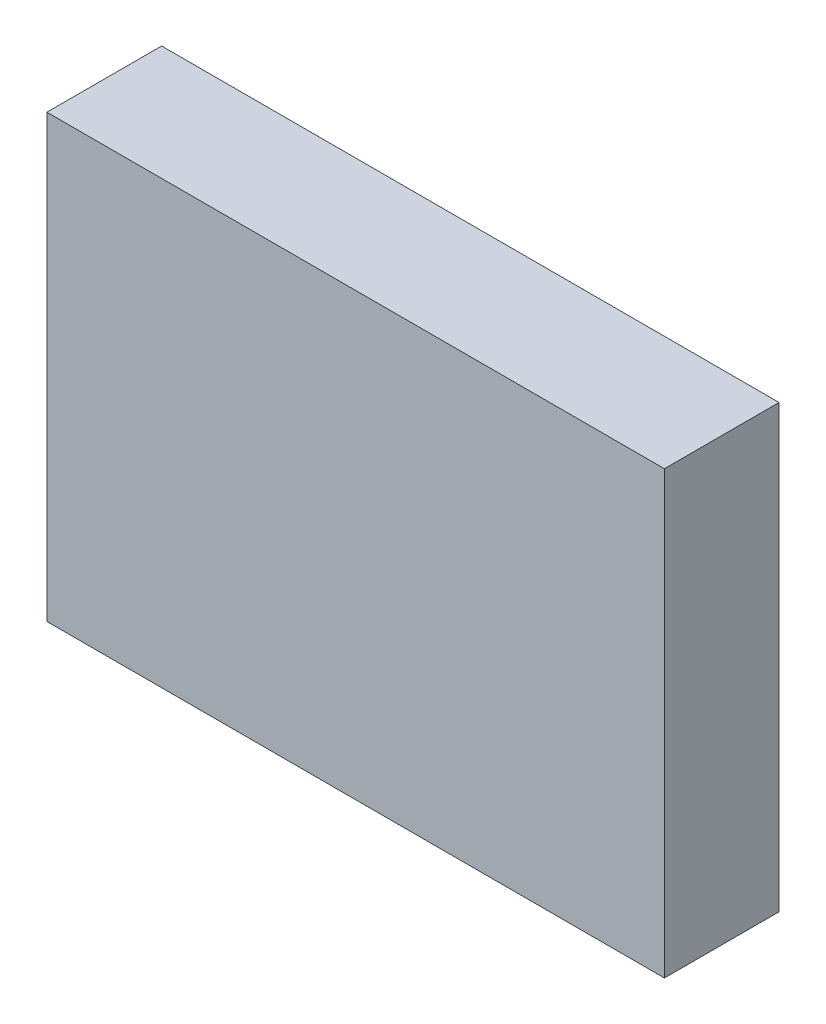
ISO-10303-21;
HEADER;
FILE_DESCRIPTION(('STEP AP214'),'2;1');
FILE_NAME('part.step','',(''),(''),'','','');
FILE_SCHEMA(('AUTOMOTIVE_DESIGN { 1 0 10303 214 1 1 1 1 }'));
ENDSEC;
DATA;
#1=APPLICATION_CONTEXT('core data for automotive mechanical design processes');
#2=APPLICATION_PROTOCOL_DEFINITION('international standard','automotive_design',2000,#1);
#3=PRODUCT_CONTEXT('',#1,'mechanical');
#4=PRODUCT('Part','Part','',(#3));
#5=PRODUCT_RELATED_PRODUCT_CATEGORY('part','',(#4));
#6=PRODUCT_DEFINITION_FORMATION('','',#4);
#7=PRODUCT_DEFINITION_CONTEXT('part definition',#1,'design');
#8=PRODUCT_DEFINITION('design','',#6,#7);
#9=PRODUCT_DEFINITION_SHAPE('','',#8);
#10=(LENGTH_UNIT() NAMED_UNIT(*) SI_UNIT(.MILLI.,.METRE.));
#11=(NAMED_UNIT(*) PLANE_ANGLE_UNIT() SI_UNIT($,.RADIAN.));
#12=(NAMED_UNIT(*) SI_UNIT($,.STERADIAN.) SOLID_ANGLE_UNIT());
#13=UNCERTAINTY_MEASURE_WITH_UNIT(LENGTH_MEASURE(1.E-05),#10,'distance_accuracy_value','');
#14=(GEOMETRIC_REPRESENTATION_CONTEXT(3) GLOBAL_UNCERTAINTY_ASSIGNED_CONTEXT((#13)) GLOBAL_UNIT_ASSIGNED_CONTEXT((#10,
#11,#12)) REPRESENTATION_CONTEXT('',''));
#15=CARTESIAN_POINT('',(0.,0.,0.));
#16=DIRECTION('',(0.,0.,1.));
#17=DIRECTION('',(1.,0.,0.));
#18=AXIS2_PLACEMENT_3D('',#15,#16,#17);
#19=CARTESIAN_POINT('',(-3.50000062,2.50000008,1.29999994));
#20=DIRECTION('',(0.,0.,1.));
#21=DIRECTION('',(1.,0.,0.));
#22=AXIS2_PLACEMENT_3D('',#19,#20,#21);
#23=PLANE('',#22);
#24=DIRECTION('',(0.,1.,0.));
#25=VECTOR('',#24,1.);
#26=CARTESIAN_POINT('',(3.50000062,2.50000008,1.29999994));
#27=LINE('',#26,#25);
#28=CARTESIAN_POINT('',(3.50000062,2.50000008,1.29999994));
#29=VERTEX_POINT('',#28);
#30=CARTESIAN_POINT('',(3.50000062,-2.50000008,1.29999994));
#31=VERTEX_POINT('',#30);
#32=EDGE_CURVE('E53',#29,#31,#27,.F.);
#33=ORIENTED_EDGE('',*,*,#32,.F.);
#34=DIRECTION('',(1.,0.,0.));
#35=VECTOR('',#34,1.);
#36=CARTESIAN_POINT('',(-3.50000062,2.50000008,1.29999994));
#37=LINE('',#36,#35);
#38=CARTESIAN_POINT('',(-3.50000062,2.50000008,1.29999994));
#39=VERTEX_POINT('',#38);
#40=EDGE_CURVE('E68',#39,#29,#37,.T.);
#41=ORIENTED_EDGE('',*,*,#40,.F.);
#42=DIRECTION('',(0.,1.,0.));
#43=VECTOR('',#42,1.);
#44=CARTESIAN_POINT('',(-3.50000062,-2.50000008,1.29999994));
#45=LINE('',#44,#43);
#46=CARTESIAN_POINT('',(-3.50000062,-2.50000008,1.29999994));
#47=VERTEX_POINT('',#46);
#48=EDGE_CURVE('E20',#47,#39,#45,.T.);
#49=ORIENTED_EDGE('',*,*,#48,.F.);
#50=DIRECTION('',(1.,0.,0.));
#51=VECTOR('',#50,1.);
#52=CARTESIAN_POINT('',(3.50000062,-2.50000008,1.29999994));
#53=LINE('',#52,#51);
#54=EDGE_CURVE('E58',#31,#47,#53,.F.);
#55=ORIENTED_EDGE('',*,*,#54,.F.);
#56=EDGE_LOOP('',(#33,#41,#49,#55));
#57=FACE_BOUND('',#56,.T.);
#58=ADVANCED_FACE('F17',(#57),#23,.T.);
#59=CARTESIAN_POINT('',(-3.50000062,-2.50000008,0.));
#60=DIRECTION('',(-1.,0.,0.));
#61=DIRECTION('',(0.,0.,1.));
#62=AXIS2_PLACEMENT_3D('',#59,#60,#61);
#63=PLANE('',#62);
#64=DIRECTION('',(0.,0.,1.));
#65=VECTOR('',#64,1.);
#66=CARTESIAN_POINT('',(-3.50000062,2.50000008,0.));
#67=LINE('',#66,#65);
#68=CARTESIAN_POINT('',(-3.50000062,2.50000008,0.));
#69=VERTEX_POINT('',#68);
#70=EDGE_CURVE('E79',#69,#39,#67,.T.);
#71=ORIENTED_EDGE('',*,*,#70,.F.);
#72=DIRECTION('',(0.,1.,0.));
#73=VECTOR('',#72,1.);
#74=CARTESIAN_POINT('',(-3.50000062,2.50000008,0.));
#75=LINE('',#74,#73);
#76=CARTESIAN_POINT('',(-3.50000062,-2.50000008,0.));
#77=VERTEX_POINT('',#76);
#78=EDGE_CURVE('E74',#69,#77,#75,.F.);
#79=ORIENTED_EDGE('',*,*,#78,.T.);
#80=DIRECTION('',(0.,0.,-1.));
#81=VECTOR('',#80,1.);
#82=CARTESIAN_POINT('',(-3.50000062,-2.50000008,0.));
#83=LINE('',#82,#81);
#84=EDGE_CURVE('E63',#47,#77,#83,.T.);
#85=ORIENTED_EDGE('',*,*,#84,.F.);
#86=ORIENTED_EDGE('',*,*,#48,.T.);
#87=EDGE_LOOP('',(#71,#79,#85,#86));
#88=FACE_BOUND('',#87,.T.);
#89=ADVANCED_FACE('F73',(#88),#63,.T.);
#90=CARTESIAN_POINT('',(3.50000062,-2.50000008,0.));
#91=DIRECTION('',(0.,-1.,0.));
#92=DIRECTION('',(0.,0.,-1.));
#93=AXIS2_PLACEMENT_3D('',#90,#91,#92);
#94=PLANE('',#93);
#95=ORIENTED_EDGE('',*,*,#84,.T.);
#96=DIRECTION('',(1.,0.,0.));
#97=VECTOR('',#96,1.);
#98=CARTESIAN_POINT('',(-3.50000062,-2.50000008,0.));
#99=LINE('',#98,#97);
#100=CARTESIAN_POINT('',(3.50000062,-2.50000008,0.));
#101=VERTEX_POINT('',#100);
#102=EDGE_CURVE('E84',#77,#101,#99,.T.);
#103=ORIENTED_EDGE('',*,*,#102,.T.);
#104=DIRECTION('',(0.,0.,-1.));
#105=VECTOR('',#104,1.);
#106=CARTESIAN_POINT('',(3.50000062,-2.50000008,0.));
#107=LINE('',#106,#105);
#108=EDGE_CURVE('E65',#31,#101,#107,.T.);
#109=ORIENTED_EDGE('',*,*,#108,.F.);
#110=ORIENTED_EDGE('',*,*,#54,.T.);
#111=EDGE_LOOP('',(#95,#103,#109,#110));
#112=FACE_BOUND('',#111,.T.);
#113=ADVANCED_FACE('F60',(#112),#94,.T.);
#114=CARTESIAN_POINT('',(3.50000062,2.50000008,0.));
#115=DIRECTION('',(1.,0.,0.));
#116=DIRECTION('',(0.,0.,-1.));
#117=AXIS2_PLACEMENT_3D('',#114,#115,#116);
#118=PLANE('',#117);
#119=ORIENTED_EDGE('',*,*,#108,.T.);
#120=DIRECTION('',(0.,1.,0.));
#121=VECTOR('',#120,1.);
#122=CARTESIAN_POINT('',(3.50000062,2.50000008,0.));
#123=LINE('',#122,#121);
#124=CARTESIAN_POINT('',(3.50000062,2.50000008,0.));
#125=VERTEX_POINT('',#124);
#126=EDGE_CURVE('E26',#101,#125,#123,.T.);
#127=ORIENTED_EDGE('',*,*,#126,.T.);
#128=DIRECTION('',(0.,0.,1.));
#129=VECTOR('',#128,1.);
#130=CARTESIAN_POINT('',(3.50000062,2.50000008,0.));
#131=LINE('',#130,#129);
#132=EDGE_CURVE('E34',#29,#125,#131,.F.);
#133=ORIENTED_EDGE('',*,*,#132,.F.);
#134=ORIENTED_EDGE('',*,*,#32,.T.);
#135=EDGE_LOOP('',(#119,#127,#133,#134));
#136=FACE_BOUND('',#135,.T.);
#137=ADVANCED_FACE('F88',(#136),#118,.T.);
#138=CARTESIAN_POINT('',(-3.50000062,2.50000008,0.));
#139=DIRECTION('',(0.,1.,0.));
#140=DIRECTION('',(0.,0.,1.));
#141=AXIS2_PLACEMENT_3D('',#138,#139,#140);
#142=PLANE('',#141);
#143=ORIENTED_EDGE('',*,*,#132,.T.);
#144=DIRECTION('',(1.,0.,0.));
#145=VECTOR('',#144,1.);
#146=CARTESIAN_POINT('',(-3.50000062,2.50000008,0.));
#147=LINE('',#146,#145);
#148=EDGE_CURVE('E11',#125,#69,#147,.F.);
#149=ORIENTED_EDGE('',*,*,#148,.T.);
#150=ORIENTED_EDGE('',*,*,#70,.T.);
#151=ORIENTED_EDGE('',*,*,#40,.T.);
#152=EDGE_LOOP('',(#143,#149,#150,#151));
#153=FACE_BOUND('',#152,.T.);
#154=ADVANCED_FACE('F91',(#153),#142,.T.);
#155=CARTESIAN_POINT('',(-3.50000062,2.50000008,0.));
#156=DIRECTION('',(0.,0.,1.));
#157=DIRECTION('',(1.,0.,0.));
#158=AXIS2_PLACEMENT_3D('',#155,#156,#157);
#159=PLANE('',#158);
#160=ORIENTED_EDGE('',*,*,#126,.F.);
#161=ORIENTED_EDGE('',*,*,#102,.F.);
#162=ORIENTED_EDGE('',*,*,#78,.F.);
#163=ORIENTED_EDGE('',*,*,#148,.F.);
#164=EDGE_LOOP('',(#160,#161,#162,#163));
#165=FACE_BOUND('',#164,.T.);
#166=ADVANCED_FACE('F90',(#165),#159,.F.);
#167=CLOSED_SHELL('',(#58,#89,#113,#137,#154,#166));
#168=MANIFOLD_SOLID_BREP('B1',#167);
#169=ADVANCED_BREP_SHAPE_REPRESENTATION('',(#18,#168),#14);
#170=SHAPE_DEFINITION_REPRESENTATION(#9,#169);
ENDSEC;
END-ISO-10303-21;
